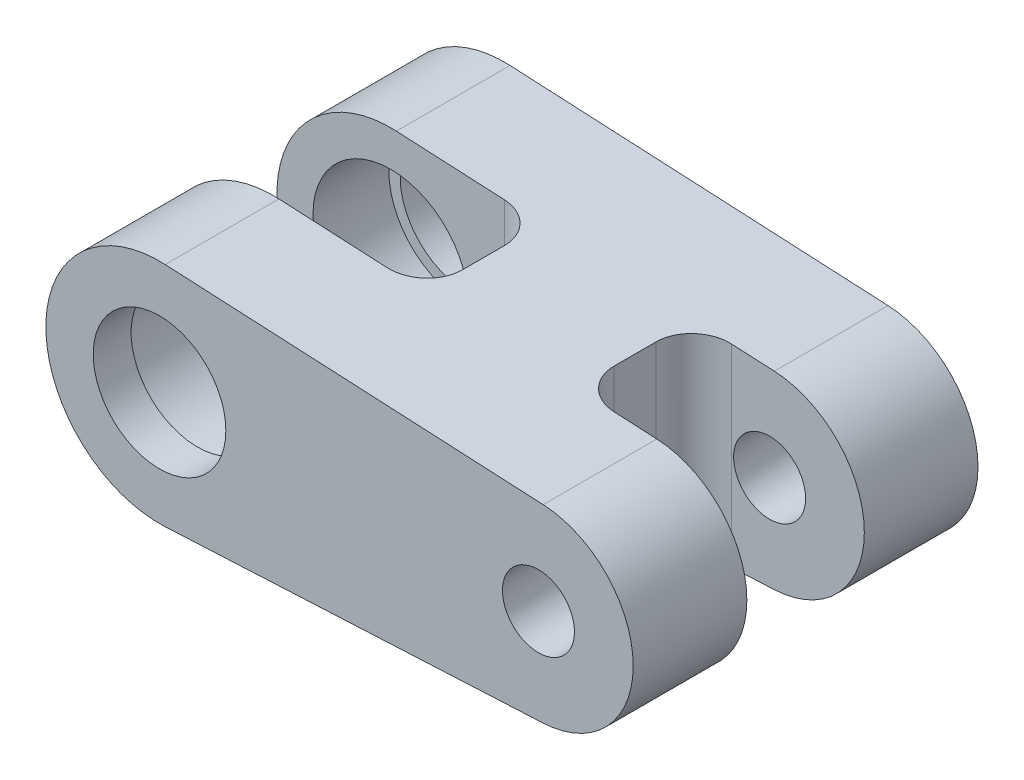
ISO-10303-21;
HEADER;
FILE_DESCRIPTION(('STEP AP214'),'2;1');
FILE_NAME('part.step','',(''),(''),'','','');
FILE_SCHEMA(('AUTOMOTIVE_DESIGN { 1 0 10303 214 1 1 1 1 }'));
ENDSEC;
DATA;
#1=APPLICATION_CONTEXT('core data for automotive mechanical design processes');
#2=APPLICATION_PROTOCOL_DEFINITION('international standard','automotive_design',2000,#1);
#3=PRODUCT_CONTEXT('',#1,'mechanical');
#4=PRODUCT('Part','Part','',(#3));
#5=PRODUCT_RELATED_PRODUCT_CATEGORY('part','',(#4));
#6=PRODUCT_DEFINITION_FORMATION('','',#4);
#7=PRODUCT_DEFINITION_CONTEXT('part definition',#1,'design');
#8=PRODUCT_DEFINITION('design','',#6,#7);
#9=PRODUCT_DEFINITION_SHAPE('','',#8);
#10=(LENGTH_UNIT() NAMED_UNIT(*) SI_UNIT(.MILLI.,.METRE.));
#11=(NAMED_UNIT(*) PLANE_ANGLE_UNIT() SI_UNIT($,.RADIAN.));
#12=(NAMED_UNIT(*) SI_UNIT($,.STERADIAN.) SOLID_ANGLE_UNIT());
#13=UNCERTAINTY_MEASURE_WITH_UNIT(LENGTH_MEASURE(1.E-05),#10,'distance_accuracy_value','');
#14=(GEOMETRIC_REPRESENTATION_CONTEXT(3) GLOBAL_UNCERTAINTY_ASSIGNED_CONTEXT((#13)) GLOBAL_UNIT_ASSIGNED_CONTEXT((#10,
#11,#12)) REPRESENTATION_CONTEXT('',''));
#15=CARTESIAN_POINT('',(0.,0.,0.));
#16=DIRECTION('',(0.,0.,1.));
#17=DIRECTION('',(1.,0.,0.));
#18=AXIS2_PLACEMENT_3D('',#15,#16,#17);
#19=CARTESIAN_POINT('',(0.,0.,-3.1));
#20=DIRECTION('',(0.,0.,-1.));
#21=DIRECTION('',(-1.,0.,0.));
#22=AXIS2_PLACEMENT_3D('',#19,#20,#21);
#23=PLANE('',#22);
#24=CARTESIAN_POINT('',(0.,0.,-3.1));
#25=DIRECTION('',(0.,0.,1.));
#26=DIRECTION('',(1.,0.,0.));
#27=AXIS2_PLACEMENT_3D('',#24,#25,#26);
#28=CIRCLE('',#27,1.9);
#29=CARTESIAN_POINT('',(1.9,0.,-3.1));
#30=VERTEX_POINT('',#29);
#31=EDGE_CURVE('E218',#30,#30,#28,.T.);
#32=ORIENTED_EDGE('',*,*,#31,.F.);
#33=EDGE_LOOP('',(#32));
#34=FACE_BOUND('',#33,.T.);
#35=DIRECTION('',(-0.998749217771909,0.0500000000000001,0.));
#36=VECTOR('',#35,1.);
#37=CARTESIAN_POINT('',(0.25,4.99374608885955,-3.1));
#38=LINE('',#37,#36);
#39=CARTESIAN_POINT('',(0.25,4.99374608885955,-3.1));
#40=VERTEX_POINT('',#39);
#41=CARTESIAN_POINT('',(-2.,5.10638697808194,-3.1));
#42=VERTEX_POINT('',#41);
#43=EDGE_CURVE('E240',#40,#42,#38,.T.);
#44=ORIENTED_EDGE('',*,*,#43,.T.);
#45=DIRECTION('',(0.,1.,0.));
#46=VECTOR('',#45,1.);
#47=CARTESIAN_POINT('',(-2.,-5.20651221294629,-3.1));
#48=LINE('',#47,#46);
#49=CARTESIAN_POINT('',(-2.,-5.10638697808194,-3.1));
#50=VERTEX_POINT('',#49);
#51=EDGE_CURVE('E60',#42,#50,#48,.F.);
#52=ORIENTED_EDGE('',*,*,#51,.T.);
#53=DIRECTION('',(0.998749217771909,0.0500000000000001,0.));
#54=VECTOR('',#53,1.);
#55=CARTESIAN_POINT('',(0.25,-4.99374608885955,-3.1));
#56=LINE('',#55,#54);
#57=CARTESIAN_POINT('',(0.25,-4.99374608885955,-3.1));
#58=VERTEX_POINT('',#57);
#59=EDGE_CURVE('E244',#50,#58,#56,.T.);
#60=ORIENTED_EDGE('',*,*,#59,.T.);
#61=CARTESIAN_POINT('',(0.,0.,-3.1));
#62=DIRECTION('',(0.,0.,1.));
#63=DIRECTION('',(-1.,0.,0.));
#64=AXIS2_PLACEMENT_3D('',#61,#62,#63);
#65=CIRCLE('',#64,5.);
#66=EDGE_CURVE('E235',#58,#40,#65,.T.);
#67=ORIENTED_EDGE('',*,*,#66,.T.);
#68=EDGE_LOOP('',(#44,#52,#60,#67));
#69=FACE_BOUND('',#68,.T.);
#70=ADVANCED_FACE('F39',(#34,#69),#23,.F.);
#71=CARTESIAN_POINT('',(-20.,0.,-3.1));
#72=DIRECTION('',(0.,0.,1.));
#73=DIRECTION('',(1.,0.,0.));
#74=AXIS2_PLACEMENT_3D('',#71,#72,#73);
#75=CIRCLE('',#74,4.1);
#76=CARTESIAN_POINT('',(-15.9,0.,-3.1));
#77=VERTEX_POINT('',#76);
#78=EDGE_CURVE('E232',#77,#77,#75,.T.);
#79=ORIENTED_EDGE('',*,*,#78,.F.);
#80=EDGE_LOOP('',(#79));
#81=FACE_BOUND('',#80,.T.);
#82=CARTESIAN_POINT('',(-19.7,-5.99249530663146,-3.1));
#83=VERTEX_POINT('',#82);
#84=CARTESIAN_POINT('',(-14.,-5.70713838726805,-3.1));
#85=VERTEX_POINT('',#84);
#86=EDGE_CURVE('E245',#83,#85,#56,.T.);
#87=ORIENTED_EDGE('',*,*,#86,.T.);
#88=DIRECTION('',(0.,-1.,0.));
#89=VECTOR('',#88,1.);
#90=CARTESIAN_POINT('',(-14.,5.6070131524037,-3.1));
#91=LINE('',#90,#89);
#92=CARTESIAN_POINT('',(-14.,5.70713838726805,-3.1));
#93=VERTEX_POINT('',#92);
#94=EDGE_CURVE('E279',#85,#93,#91,.F.);
#95=ORIENTED_EDGE('',*,*,#94,.T.);
#96=CARTESIAN_POINT('',(-19.7,5.99249530663146,-3.1));
#97=VERTEX_POINT('',#96);
#98=EDGE_CURVE('E238',#93,#97,#38,.T.);
#99=ORIENTED_EDGE('',*,*,#98,.T.);
#100=CARTESIAN_POINT('',(-20.,0.,-3.1));
#101=DIRECTION('',(0.,0.,1.));
#102=DIRECTION('',(1.,0.,0.));
#103=AXIS2_PLACEMENT_3D('',#100,#101,#102);
#104=CIRCLE('',#103,6.);
#105=EDGE_CURVE('E242',#97,#83,#104,.T.);
#106=ORIENTED_EDGE('',*,*,#105,.T.);
#107=EDGE_LOOP('',(#87,#95,#99,#106));
#108=FACE_BOUND('',#107,.T.);
#109=ADVANCED_FACE('F331',(#81,#108),#23,.F.);
#110=CARTESIAN_POINT('',(0.,0.,-3.1));
#111=DIRECTION('',(0.,0.,-1.));
#112=DIRECTION('',(-1.,0.,0.));
#113=AXIS2_PLACEMENT_3D('',#110,#111,#112);
#114=CYLINDRICAL_SURFACE('',#113,5.);
#115=CARTESIAN_POINT('',(0.,0.,-9.1));
#116=DIRECTION('',(0.,0.,1.));
#117=DIRECTION('',(-1.,0.,0.));
#118=AXIS2_PLACEMENT_3D('',#115,#116,#117);
#119=CIRCLE('',#118,5.);
#120=CARTESIAN_POINT('',(0.25,-4.99374608885955,-9.1));
#121=VERTEX_POINT('',#120);
#122=CARTESIAN_POINT('',(0.25,4.99374608885955,-9.1));
#123=VERTEX_POINT('',#122);
#124=EDGE_CURVE('E231',#121,#123,#119,.T.);
#125=ORIENTED_EDGE('',*,*,#124,.T.);
#126=DIRECTION('',(0.,0.,-1.));
#127=VECTOR('',#126,1.);
#128=CARTESIAN_POINT('',(0.25,4.99374608885955,-3.1));
#129=LINE('',#128,#127);
#130=EDGE_CURVE('E264',#40,#123,#129,.T.);
#131=ORIENTED_EDGE('',*,*,#130,.F.);
#132=ORIENTED_EDGE('',*,*,#66,.F.);
#133=DIRECTION('',(0.,0.,-1.));
#134=VECTOR('',#133,1.);
#135=CARTESIAN_POINT('',(0.25,-4.99374608885955,-3.1));
#136=LINE('',#135,#134);
#137=EDGE_CURVE('E248',#58,#121,#136,.T.);
#138=ORIENTED_EDGE('',*,*,#137,.T.);
#139=EDGE_LOOP('',(#125,#131,#132,#138));
#140=FACE_BOUND('',#139,.T.);
#141=ADVANCED_FACE('F316',(#140),#114,.T.);
#142=CARTESIAN_POINT('',(0.25,4.99374608885955,-3.1));
#143=DIRECTION('',(-0.05,-0.998749217771909,0.));
#144=DIRECTION('',(0.998749217771909,-0.0500000000000001,0.));
#145=AXIS2_PLACEMENT_3D('',#142,#143,#144);
#146=PLANE('',#145);
#147=DIRECTION('',(-0.998749217771909,0.0500000000000001,0.));
#148=VECTOR('',#147,1.);
#149=CARTESIAN_POINT('',(0.25,4.99374608885955,-9.1));
#150=LINE('',#149,#148);
#151=CARTESIAN_POINT('',(-19.7,5.99249530663146,-9.1));
#152=VERTEX_POINT('',#151);
#153=EDGE_CURVE('E251',#123,#152,#150,.T.);
#154=ORIENTED_EDGE('',*,*,#153,.T.);
#155=DIRECTION('',(0.,0.,-1.));
#156=VECTOR('',#155,1.);
#157=CARTESIAN_POINT('',(-19.7,5.99249530663146,-3.1));
#158=LINE('',#157,#156);
#159=EDGE_CURVE('E261',#97,#152,#158,.T.);
#160=ORIENTED_EDGE('',*,*,#159,.F.);
#161=ORIENTED_EDGE('',*,*,#98,.F.);
#162=CARTESIAN_POINT('',(-14.,5.70713838726805,-1.1));
#163=DIRECTION('',(-0.05,-0.998749217771909,0.));
#164=DIRECTION('',(-0.998749217771909,0.0500000000000001,0.));
#165=AXIS2_PLACEMENT_3D('',#162,#163,#164);
#166=ELLIPSE('',#165,2.00250469728704,2.);
#167=CARTESIAN_POINT('',(-12.,5.6070131524037,-1.1));
#168=VERTEX_POINT('',#167);
#169=EDGE_CURVE('E294',#93,#168,#166,.T.);
#170=ORIENTED_EDGE('',*,*,#169,.T.);
#171=DIRECTION('',(0.,0.,-1.));
#172=VECTOR('',#171,1.);
#173=CARTESIAN_POINT('',(-12.,5.6070131524037,13.7751365134765));
#174=LINE('',#173,#172);
#175=CARTESIAN_POINT('',(-12.,5.6070131524037,1.1));
#176=VERTEX_POINT('',#175);
#177=EDGE_CURVE('E212',#176,#168,#174,.T.);
#178=ORIENTED_EDGE('',*,*,#177,.F.);
#179=CARTESIAN_POINT('',(-14.,5.70713838726805,1.1));
#180=DIRECTION('',(-0.05,-0.998749217771909,0.));
#181=DIRECTION('',(-0.998749217771909,0.0500000000000001,0.));
#182=AXIS2_PLACEMENT_3D('',#179,#180,#181);
#183=ELLIPSE('',#182,2.00250469728704,2.);
#184=CARTESIAN_POINT('',(-14.,5.70713838726805,3.1));
#185=VERTEX_POINT('',#184);
#186=EDGE_CURVE('E290',#176,#185,#183,.T.);
#187=ORIENTED_EDGE('',*,*,#186,.T.);
#188=DIRECTION('',(-0.998749217771909,0.0500000000000001,0.));
#189=VECTOR('',#188,1.);
#190=CARTESIAN_POINT('',(0.25,4.99374608885955,3.1));
#191=LINE('',#190,#189);
#192=CARTESIAN_POINT('',(-19.7,5.99249530663146,3.1));
#193=VERTEX_POINT('',#192);
#194=EDGE_CURVE('E171',#185,#193,#191,.T.);
#195=ORIENTED_EDGE('',*,*,#194,.T.);
#196=DIRECTION('',(0.,0.,1.));
#197=VECTOR('',#196,1.);
#198=CARTESIAN_POINT('',(-19.7,5.99249530663146,3.1));
#199=LINE('',#198,#197);
#200=CARTESIAN_POINT('',(-19.7,5.99249530663146,9.1));
#201=VERTEX_POINT('',#200);
#202=EDGE_CURVE('E161',#193,#201,#199,.T.);
#203=ORIENTED_EDGE('',*,*,#202,.T.);
#204=DIRECTION('',(-0.998749217771909,0.0500000000000001,0.));
#205=VECTOR('',#204,1.);
#206=CARTESIAN_POINT('',(0.25,4.99374608885955,9.1));
#207=LINE('',#206,#205);
#208=CARTESIAN_POINT('',(0.25,4.99374608885955,9.1));
#209=VERTEX_POINT('',#208);
#210=EDGE_CURVE('E156',#209,#201,#207,.T.);
#211=ORIENTED_EDGE('',*,*,#210,.F.);
#212=DIRECTION('',(0.,0.,1.));
#213=VECTOR('',#212,1.);
#214=CARTESIAN_POINT('',(0.25,4.99374608885955,3.1));
#215=LINE('',#214,#213);
#216=CARTESIAN_POINT('',(0.25,4.99374608885955,3.1));
#217=VERTEX_POINT('',#216);
#218=EDGE_CURVE('E149',#217,#209,#215,.T.);
#219=ORIENTED_EDGE('',*,*,#218,.F.);
#220=CARTESIAN_POINT('',(-2.,5.10638697808194,3.1));
#221=VERTEX_POINT('',#220);
#222=EDGE_CURVE('E153',#217,#221,#191,.T.);
#223=ORIENTED_EDGE('',*,*,#222,.T.);
#224=CARTESIAN_POINT('',(-2.,5.10638697808194,1.1));
#225=DIRECTION('',(-0.05,-0.998749217771909,0.));
#226=DIRECTION('',(0.998749217771909,-0.0500000000000001,0.));
#227=AXIS2_PLACEMENT_3D('',#224,#225,#226);
#228=ELLIPSE('',#227,2.00250469728704,2.);
#229=CARTESIAN_POINT('',(-4.,5.20651221294629,1.1));
#230=VERTEX_POINT('',#229);
#231=EDGE_CURVE('E296',#221,#230,#228,.T.);
#232=ORIENTED_EDGE('',*,*,#231,.T.);
#233=DIRECTION('',(0.,0.,-1.));
#234=VECTOR('',#233,1.);
#235=CARTESIAN_POINT('',(-4.,5.20651221294629,13.7751365134765));
#236=LINE('',#235,#234);
#237=CARTESIAN_POINT('',(-4.,5.20651221294629,-1.1));
#238=VERTEX_POINT('',#237);
#239=EDGE_CURVE('E210',#230,#238,#236,.T.);
#240=ORIENTED_EDGE('',*,*,#239,.T.);
#241=CARTESIAN_POINT('',(-2.,5.10638697808194,-1.1));
#242=DIRECTION('',(-0.05,-0.998749217771909,0.));
#243=DIRECTION('',(0.998749217771909,-0.0500000000000001,0.));
#244=AXIS2_PLACEMENT_3D('',#241,#242,#243);
#245=ELLIPSE('',#244,2.00250469728704,2.);
#246=EDGE_CURVE('E47',#238,#42,#245,.T.);
#247=ORIENTED_EDGE('',*,*,#246,.T.);
#248=ORIENTED_EDGE('',*,*,#43,.F.);
#249=ORIENTED_EDGE('',*,*,#130,.T.);
#250=EDGE_LOOP('',(#154,#160,#161,#170,#178,#187,#195,#203,#211,#219,#223,#232,#240,#247,#248,#249));
#251=FACE_BOUND('',#250,.T.);
#252=ADVANCED_FACE('F151',(#251),#146,.F.);
#253=CARTESIAN_POINT('',(-20.,0.,-3.1));
#254=DIRECTION('',(0.,0.,-1.));
#255=DIRECTION('',(-1.,0.,0.));
#256=AXIS2_PLACEMENT_3D('',#253,#254,#255);
#257=CYLINDRICAL_SURFACE('',#256,6.);
#258=CARTESIAN_POINT('',(-20.,0.,-9.1));
#259=DIRECTION('',(0.,0.,1.));
#260=DIRECTION('',(1.,0.,0.));
#261=AXIS2_PLACEMENT_3D('',#258,#259,#260);
#262=CIRCLE('',#261,6.);
#263=CARTESIAN_POINT('',(-19.7,-5.99249530663146,-9.1));
#264=VERTEX_POINT('',#263);
#265=EDGE_CURVE('E253',#152,#264,#262,.T.);
#266=ORIENTED_EDGE('',*,*,#265,.T.);
#267=DIRECTION('',(0.,0.,-1.));
#268=VECTOR('',#267,1.);
#269=CARTESIAN_POINT('',(-19.7,-5.99249530663146,-3.1));
#270=LINE('',#269,#268);
#271=EDGE_CURVE('E258',#83,#264,#270,.T.);
#272=ORIENTED_EDGE('',*,*,#271,.F.);
#273=ORIENTED_EDGE('',*,*,#105,.F.);
#274=ORIENTED_EDGE('',*,*,#159,.T.);
#275=EDGE_LOOP('',(#266,#272,#273,#274));
#276=FACE_BOUND('',#275,.T.);
#277=ADVANCED_FACE('F324',(#276),#257,.T.);
#278=CARTESIAN_POINT('',(0.25,-4.99374608885955,-3.1));
#279=DIRECTION('',(-0.05,0.998749217771909,0.));
#280=DIRECTION('',(-0.998749217771909,-0.0500000000000001,0.));
#281=AXIS2_PLACEMENT_3D('',#278,#279,#280);
#282=PLANE('',#281);
#283=DIRECTION('',(0.998749217771909,0.0500000000000001,0.));
#284=VECTOR('',#283,1.);
#285=CARTESIAN_POINT('',(0.25,-4.99374608885955,-9.1));
#286=LINE('',#285,#284);
#287=EDGE_CURVE('E239',#264,#121,#286,.T.);
#288=ORIENTED_EDGE('',*,*,#287,.T.);
#289=ORIENTED_EDGE('',*,*,#137,.F.);
#290=ORIENTED_EDGE('',*,*,#59,.F.);
#291=CARTESIAN_POINT('',(-2.,-5.10638697808194,-1.1));
#292=DIRECTION('',(-0.05,0.998749217771909,0.));
#293=DIRECTION('',(-0.998749217771909,-0.0500000000000001,0.));
#294=AXIS2_PLACEMENT_3D('',#291,#292,#293);
#295=ELLIPSE('',#294,2.00250469728704,2.);
#296=CARTESIAN_POINT('',(-4.,-5.20651221294629,-1.1));
#297=VERTEX_POINT('',#296);
#298=EDGE_CURVE('E11',#50,#297,#295,.T.);
#299=ORIENTED_EDGE('',*,*,#298,.T.);
#300=DIRECTION('',(0.,0.,-1.));
#301=VECTOR('',#300,1.);
#302=CARTESIAN_POINT('',(-4.,-5.20651221294629,13.7751365134765));
#303=LINE('',#302,#301);
#304=CARTESIAN_POINT('',(-4.,-5.20651221294629,1.1));
#305=VERTEX_POINT('',#304);
#306=EDGE_CURVE('E160',#305,#297,#303,.T.);
#307=ORIENTED_EDGE('',*,*,#306,.F.);
#308=CARTESIAN_POINT('',(-2.,-5.10638697808194,1.1));
#309=DIRECTION('',(-0.05,0.998749217771909,0.));
#310=DIRECTION('',(-0.998749217771909,-0.0500000000000001,0.));
#311=AXIS2_PLACEMENT_3D('',#308,#309,#310);
#312=ELLIPSE('',#311,2.00250469728704,2.);
#313=CARTESIAN_POINT('',(-2.,-5.10638697808194,3.1));
#314=VERTEX_POINT('',#313);
#315=EDGE_CURVE('E298',#305,#314,#312,.T.);
#316=ORIENTED_EDGE('',*,*,#315,.T.);
#317=DIRECTION('',(0.998749217771909,0.0500000000000001,0.));
#318=VECTOR('',#317,1.);
#319=CARTESIAN_POINT('',(0.25,-4.99374608885955,3.1));
#320=LINE('',#319,#318);
#321=CARTESIAN_POINT('',(0.25,-4.99374608885955,3.1));
#322=VERTEX_POINT('',#321);
#323=EDGE_CURVE('E181',#314,#322,#320,.T.);
#324=ORIENTED_EDGE('',*,*,#323,.T.);
#325=DIRECTION('',(0.,0.,1.));
#326=VECTOR('',#325,1.);
#327=CARTESIAN_POINT('',(0.25,-4.99374608885955,3.1));
#328=LINE('',#327,#326);
#329=CARTESIAN_POINT('',(0.25,-4.99374608885955,9.1));
#330=VERTEX_POINT('',#329);
#331=EDGE_CURVE('E168',#322,#330,#328,.T.);
#332=ORIENTED_EDGE('',*,*,#331,.T.);
#333=DIRECTION('',(0.998749217771909,0.0500000000000001,0.));
#334=VECTOR('',#333,1.);
#335=CARTESIAN_POINT('',(0.25,-4.99374608885955,9.1));
#336=LINE('',#335,#334);
#337=CARTESIAN_POINT('',(-19.7,-5.99249530663146,9.1));
#338=VERTEX_POINT('',#337);
#339=EDGE_CURVE('E172',#338,#330,#336,.T.);
#340=ORIENTED_EDGE('',*,*,#339,.F.);
#341=DIRECTION('',(0.,0.,1.));
#342=VECTOR('',#341,1.);
#343=CARTESIAN_POINT('',(-19.7,-5.99249530663146,3.1));
#344=LINE('',#343,#342);
#345=CARTESIAN_POINT('',(-19.7,-5.99249530663146,3.1));
#346=VERTEX_POINT('',#345);
#347=EDGE_CURVE('E197',#346,#338,#344,.T.);
#348=ORIENTED_EDGE('',*,*,#347,.F.);
#349=CARTESIAN_POINT('',(-14.,-5.70713838726805,3.1));
#350=VERTEX_POINT('',#349);
#351=EDGE_CURVE('E185',#346,#350,#320,.T.);
#352=ORIENTED_EDGE('',*,*,#351,.T.);
#353=CARTESIAN_POINT('',(-14.,-5.70713838726805,1.1));
#354=DIRECTION('',(-0.05,0.998749217771909,0.));
#355=DIRECTION('',(0.998749217771909,0.0500000000000001,0.));
#356=AXIS2_PLACEMENT_3D('',#353,#354,#355);
#357=ELLIPSE('',#356,2.00250469728704,2.);
#358=CARTESIAN_POINT('',(-12.,-5.6070131524037,1.1));
#359=VERTEX_POINT('',#358);
#360=EDGE_CURVE('E288',#350,#359,#357,.T.);
#361=ORIENTED_EDGE('',*,*,#360,.T.);
#362=DIRECTION('',(0.,0.,-1.));
#363=VECTOR('',#362,1.);
#364=CARTESIAN_POINT('',(-12.,-5.6070131524037,13.7751365134765));
#365=LINE('',#364,#363);
#366=CARTESIAN_POINT('',(-12.,-5.6070131524037,-1.1));
#367=VERTEX_POINT('',#366);
#368=EDGE_CURVE('E215',#359,#367,#365,.T.);
#369=ORIENTED_EDGE('',*,*,#368,.T.);
#370=CARTESIAN_POINT('',(-14.,-5.70713838726805,-1.1));
#371=DIRECTION('',(-0.05,0.998749217771909,0.));
#372=DIRECTION('',(0.998749217771909,0.0500000000000001,0.));
#373=AXIS2_PLACEMENT_3D('',#370,#371,#372);
#374=ELLIPSE('',#373,2.00250469728704,2.);
#375=EDGE_CURVE('E292',#367,#85,#374,.T.);
#376=ORIENTED_EDGE('',*,*,#375,.T.);
#377=ORIENTED_EDGE('',*,*,#86,.F.);
#378=ORIENTED_EDGE('',*,*,#271,.T.);
#379=EDGE_LOOP('',(#288,#289,#290,#299,#307,#316,#324,#332,#340,#348,#352,#361,#369,#376,#377,#378));
#380=FACE_BOUND('',#379,.T.);
#381=ADVANCED_FACE('F302',(#380),#282,.F.);
#382=CARTESIAN_POINT('',(0.,0.,-9.1));
#383=DIRECTION('',(0.,0.,-1.));
#384=DIRECTION('',(-1.,0.,0.));
#385=AXIS2_PLACEMENT_3D('',#382,#383,#384);
#386=PLANE('',#385);
#387=CARTESIAN_POINT('',(0.,0.,-9.1));
#388=DIRECTION('',(0.,0.,-1.));
#389=DIRECTION('',(-1.,0.,0.));
#390=AXIS2_PLACEMENT_3D('',#387,#388,#389);
#391=CIRCLE('',#390,1.9);
#392=CARTESIAN_POINT('',(-1.9,0.,-9.1));
#393=VERTEX_POINT('',#392);
#394=EDGE_CURVE('E223',#393,#393,#391,.T.);
#395=ORIENTED_EDGE('',*,*,#394,.F.);
#396=EDGE_LOOP('',(#395));
#397=FACE_BOUND('',#396,.T.);
#398=CARTESIAN_POINT('',(-20.,0.,-9.1));
#399=DIRECTION('',(0.,0.,1.));
#400=DIRECTION('',(1.,0.,0.));
#401=AXIS2_PLACEMENT_3D('',#398,#399,#400);
#402=CIRCLE('',#401,3.5);
#403=CARTESIAN_POINT('',(-16.5,0.,-9.1));
#404=VERTEX_POINT('',#403);
#405=EDGE_CURVE('E224',#404,#404,#402,.T.);
#406=ORIENTED_EDGE('',*,*,#405,.T.);
#407=EDGE_LOOP('',(#406));
#408=FACE_BOUND('',#407,.T.);
#409=ORIENTED_EDGE('',*,*,#124,.F.);
#410=ORIENTED_EDGE('',*,*,#287,.F.);
#411=ORIENTED_EDGE('',*,*,#265,.F.);
#412=ORIENTED_EDGE('',*,*,#153,.F.);
#413=EDGE_LOOP('',(#409,#410,#411,#412));
#414=FACE_BOUND('',#413,.T.);
#415=ADVANCED_FACE('F327',(#397,#408,#414),#386,.T.);
#416=CARTESIAN_POINT('',(-20.,0.,-7.1));
#417=DIRECTION('',(0.,0.,1.));
#418=DIRECTION('',(1.,0.,0.));
#419=AXIS2_PLACEMENT_3D('',#416,#417,#418);
#420=CYLINDRICAL_SURFACE('',#419,4.1);
#421=CARTESIAN_POINT('',(-20.,0.,-7.1));
#422=DIRECTION('',(0.,0.,1.));
#423=DIRECTION('',(1.,0.,0.));
#424=AXIS2_PLACEMENT_3D('',#421,#422,#423);
#425=CIRCLE('',#424,4.1);
#426=CARTESIAN_POINT('',(-15.9,0.,-7.1));
#427=VERTEX_POINT('',#426);
#428=EDGE_CURVE('E228',#427,#427,#425,.T.);
#429=ORIENTED_EDGE('',*,*,#428,.F.);
#430=EDGE_LOOP('',(#429));
#431=FACE_BOUND('',#430,.T.);
#432=ORIENTED_EDGE('',*,*,#78,.T.);
#433=EDGE_LOOP('',(#432));
#434=FACE_BOUND('',#433,.T.);
#435=ADVANCED_FACE('F379',(#431,#434),#420,.F.);
#436=CARTESIAN_POINT('',(-20.,0.,-7.1));
#437=DIRECTION('',(0.,0.,1.));
#438=DIRECTION('',(1.,0.,0.));
#439=AXIS2_PLACEMENT_3D('',#436,#437,#438);
#440=PLANE('',#439);
#441=CARTESIAN_POINT('',(-20.,0.,-7.1));
#442=DIRECTION('',(0.,0.,1.));
#443=DIRECTION('',(1.,0.,0.));
#444=AXIS2_PLACEMENT_3D('',#441,#442,#443);
#445=CIRCLE('',#444,3.5);
#446=CARTESIAN_POINT('',(-16.5,0.,-7.1));
#447=VERTEX_POINT('',#446);
#448=EDGE_CURVE('E227',#447,#447,#445,.T.);
#449=ORIENTED_EDGE('',*,*,#448,.F.);
#450=EDGE_LOOP('',(#449));
#451=FACE_BOUND('',#450,.T.);
#452=ORIENTED_EDGE('',*,*,#428,.T.);
#453=EDGE_LOOP('',(#452));
#454=FACE_BOUND('',#453,.T.);
#455=ADVANCED_FACE('F571',(#451,#454),#440,.T.);
#456=CARTESIAN_POINT('',(-20.,0.,-9.1));
#457=DIRECTION('',(0.,0.,1.));
#458=DIRECTION('',(1.,0.,0.));
#459=AXIS2_PLACEMENT_3D('',#456,#457,#458);
#460=CYLINDRICAL_SURFACE('',#459,3.5);
#461=ORIENTED_EDGE('',*,*,#448,.T.);
#462=EDGE_LOOP('',(#461));
#463=FACE_BOUND('',#462,.T.);
#464=ORIENTED_EDGE('',*,*,#405,.F.);
#465=EDGE_LOOP('',(#464));
#466=FACE_BOUND('',#465,.T.);
#467=ADVANCED_FACE('F552',(#463,#466),#460,.F.);
#468=CARTESIAN_POINT('',(0.,0.,-13.1));
#469=DIRECTION('',(0.,0.,1.));
#470=DIRECTION('',(1.,0.,0.));
#471=AXIS2_PLACEMENT_3D('',#468,#469,#470);
#472=CYLINDRICAL_SURFACE('',#471,1.9);
#473=ORIENTED_EDGE('',*,*,#394,.T.);
#474=EDGE_LOOP('',(#473));
#475=FACE_BOUND('',#474,.T.);
#476=ORIENTED_EDGE('',*,*,#31,.T.);
#477=EDGE_LOOP('',(#476));
#478=FACE_BOUND('',#477,.T.);
#479=ADVANCED_FACE('F462',(#475,#478),#472,.F.);
#480=CARTESIAN_POINT('',(-4.,5.20651221294629,13.7751365134765));
#481=DIRECTION('',(-1.,0.,0.));
#482=DIRECTION('',(0.,-1.,0.));
#483=AXIS2_PLACEMENT_3D('',#480,#481,#482);
#484=PLANE('',#483);
#485=ORIENTED_EDGE('',*,*,#239,.F.);
#486=DIRECTION('',(0.,1.,0.));
#487=VECTOR('',#486,1.);
#488=CARTESIAN_POINT('',(-4.,-5.20651221294629,1.1));
#489=LINE('',#488,#487);
#490=EDGE_CURVE('E285',#230,#305,#489,.F.);
#491=ORIENTED_EDGE('',*,*,#490,.T.);
#492=ORIENTED_EDGE('',*,*,#306,.T.);
#493=DIRECTION('',(0.,1.,0.));
#494=VECTOR('',#493,1.);
#495=CARTESIAN_POINT('',(-4.,5.20651221294629,-1.1));
#496=LINE('',#495,#494);
#497=EDGE_CURVE('E282',#297,#238,#496,.T.);
#498=ORIENTED_EDGE('',*,*,#497,.T.);
#499=EDGE_LOOP('',(#485,#491,#492,#498));
#500=FACE_BOUND('',#499,.T.);
#501=ADVANCED_FACE('F308',(#500),#484,.F.);
#502=CARTESIAN_POINT('',(-12.,5.6070131524037,13.7751365134765));
#503=DIRECTION('',(1.,0.,0.));
#504=DIRECTION('',(0.,1.,0.));
#505=AXIS2_PLACEMENT_3D('',#502,#503,#504);
#506=PLANE('',#505);
#507=ORIENTED_EDGE('',*,*,#368,.F.);
#508=DIRECTION('',(0.,-1.,0.));
#509=VECTOR('',#508,1.);
#510=CARTESIAN_POINT('',(-12.,5.6070131524037,1.1));
#511=LINE('',#510,#509);
#512=EDGE_CURVE('E277',#359,#176,#511,.F.);
#513=ORIENTED_EDGE('',*,*,#512,.T.);
#514=ORIENTED_EDGE('',*,*,#177,.T.);
#515=DIRECTION('',(0.,-1.,0.));
#516=VECTOR('',#515,1.);
#517=CARTESIAN_POINT('',(-12.,-5.6070131524037,-1.1));
#518=LINE('',#517,#516);
#519=EDGE_CURVE('E274',#168,#367,#518,.T.);
#520=ORIENTED_EDGE('',*,*,#519,.T.);
#521=EDGE_LOOP('',(#507,#513,#514,#520));
#522=FACE_BOUND('',#521,.T.);
#523=ADVANCED_FACE('F340',(#522),#506,.F.);
#524=CARTESIAN_POINT('',(0.,0.,3.1));
#525=DIRECTION('',(0.,0.,1.));
#526=DIRECTION('',(-1.,0.,0.));
#527=AXIS2_PLACEMENT_3D('',#524,#525,#526);
#528=PLANE('',#527);
#529=CARTESIAN_POINT('',(0.,0.,3.1));
#530=DIRECTION('',(0.,0.,1.));
#531=DIRECTION('',(1.,0.,0.));
#532=AXIS2_PLACEMENT_3D('',#529,#530,#531);
#533=CIRCLE('',#532,1.9);
#534=CARTESIAN_POINT('',(1.9,0.,3.1));
#535=VERTEX_POINT('',#534);
#536=EDGE_CURVE('E209',#535,#535,#533,.T.);
#537=ORIENTED_EDGE('',*,*,#536,.T.);
#538=EDGE_LOOP('',(#537));
#539=FACE_BOUND('',#538,.T.);
#540=ORIENTED_EDGE('',*,*,#323,.F.);
#541=DIRECTION('',(0.,1.,0.));
#542=VECTOR('',#541,1.);
#543=CARTESIAN_POINT('',(-2.,5.20651221294629,3.1));
#544=LINE('',#543,#542);
#545=EDGE_CURVE('E177',#314,#221,#544,.T.);
#546=ORIENTED_EDGE('',*,*,#545,.T.);
#547=ORIENTED_EDGE('',*,*,#222,.F.);
#548=CARTESIAN_POINT('',(0.,0.,3.1));
#549=DIRECTION('',(0.,0.,1.));
#550=DIRECTION('',(-1.,0.,0.));
#551=AXIS2_PLACEMENT_3D('',#548,#549,#550);
#552=CIRCLE('',#551,5.);
#553=EDGE_CURVE('E165',#322,#217,#552,.T.);
#554=ORIENTED_EDGE('',*,*,#553,.F.);
#555=EDGE_LOOP('',(#540,#546,#547,#554));
#556=FACE_BOUND('',#555,.T.);
#557=ADVANCED_FACE('F175',(#539,#556),#528,.F.);
#558=CARTESIAN_POINT('',(-20.,0.,3.1));
#559=DIRECTION('',(0.,0.,1.));
#560=DIRECTION('',(1.,0.,0.));
#561=AXIS2_PLACEMENT_3D('',#558,#559,#560);
#562=CIRCLE('',#561,4.1);
#563=CARTESIAN_POINT('',(-15.9,0.,3.1));
#564=VERTEX_POINT('',#563);
#565=EDGE_CURVE('E204',#564,#564,#562,.T.);
#566=ORIENTED_EDGE('',*,*,#565,.T.);
#567=EDGE_LOOP('',(#566));
#568=FACE_BOUND('',#567,.T.);
#569=ORIENTED_EDGE('',*,*,#194,.F.);
#570=DIRECTION('',(0.,-1.,0.));
#571=VECTOR('',#570,1.);
#572=CARTESIAN_POINT('',(-14.,-5.6070131524037,3.1));
#573=LINE('',#572,#571);
#574=EDGE_CURVE('E267',#185,#350,#573,.T.);
#575=ORIENTED_EDGE('',*,*,#574,.T.);
#576=ORIENTED_EDGE('',*,*,#351,.F.);
#577=CARTESIAN_POINT('',(-20.,0.,3.1));
#578=DIRECTION('',(0.,0.,1.));
#579=DIRECTION('',(1.,0.,0.));
#580=AXIS2_PLACEMENT_3D('',#577,#578,#579);
#581=CIRCLE('',#580,6.);
#582=EDGE_CURVE('E178',#193,#346,#581,.T.);
#583=ORIENTED_EDGE('',*,*,#582,.F.);
#584=EDGE_LOOP('',(#569,#575,#576,#583));
#585=FACE_BOUND('',#584,.T.);
#586=ADVANCED_FACE('F349',(#568,#585),#528,.F.);
#587=CARTESIAN_POINT('',(0.,0.,3.1));
#588=DIRECTION('',(0.,0.,1.));
#589=DIRECTION('',(-1.,0.,0.));
#590=AXIS2_PLACEMENT_3D('',#587,#588,#589);
#591=CYLINDRICAL_SURFACE('',#590,5.);
#592=CARTESIAN_POINT('',(0.,0.,9.1));
#593=DIRECTION('',(0.,0.,1.));
#594=DIRECTION('',(-1.,0.,0.));
#595=AXIS2_PLACEMENT_3D('',#592,#593,#594);
#596=CIRCLE('',#595,5.);
#597=EDGE_CURVE('E188',#330,#209,#596,.T.);
#598=ORIENTED_EDGE('',*,*,#597,.F.);
#599=ORIENTED_EDGE('',*,*,#331,.F.);
#600=ORIENTED_EDGE('',*,*,#553,.T.);
#601=ORIENTED_EDGE('',*,*,#218,.T.);
#602=EDGE_LOOP('',(#598,#599,#600,#601));
#603=FACE_BOUND('',#602,.T.);
#604=ADVANCED_FACE('F166',(#603),#591,.T.);
#605=CARTESIAN_POINT('',(-20.,0.,3.1));
#606=DIRECTION('',(0.,0.,1.));
#607=DIRECTION('',(-1.,0.,0.));
#608=AXIS2_PLACEMENT_3D('',#605,#606,#607);
#609=CYLINDRICAL_SURFACE('',#608,6.);
#610=CARTESIAN_POINT('',(-20.,0.,9.1));
#611=DIRECTION('',(0.,0.,1.));
#612=DIRECTION('',(1.,0.,0.));
#613=AXIS2_PLACEMENT_3D('',#610,#611,#612);
#614=CIRCLE('',#613,6.);
#615=EDGE_CURVE('E192',#201,#338,#614,.T.);
#616=ORIENTED_EDGE('',*,*,#615,.F.);
#617=ORIENTED_EDGE('',*,*,#202,.F.);
#618=ORIENTED_EDGE('',*,*,#582,.T.);
#619=ORIENTED_EDGE('',*,*,#347,.T.);
#620=EDGE_LOOP('',(#616,#617,#618,#619));
#621=FACE_BOUND('',#620,.T.);
#622=ADVANCED_FACE('F352',(#621),#609,.T.);
#623=CARTESIAN_POINT('',(0.,0.,9.1));
#624=DIRECTION('',(0.,0.,1.));
#625=DIRECTION('',(-1.,0.,0.));
#626=AXIS2_PLACEMENT_3D('',#623,#624,#625);
#627=PLANE('',#626);
#628=CARTESIAN_POINT('',(0.,0.,9.1));
#629=DIRECTION('',(0.,0.,-1.));
#630=DIRECTION('',(-1.,0.,0.));
#631=AXIS2_PLACEMENT_3D('',#628,#629,#630);
#632=CIRCLE('',#631,1.9);
#633=CARTESIAN_POINT('',(-1.9,0.,9.1));
#634=VERTEX_POINT('',#633);
#635=EDGE_CURVE('E206',#634,#634,#632,.T.);
#636=ORIENTED_EDGE('',*,*,#635,.T.);
#637=EDGE_LOOP('',(#636));
#638=FACE_BOUND('',#637,.T.);
#639=CARTESIAN_POINT('',(-20.,0.,9.1));
#640=DIRECTION('',(0.,0.,1.));
#641=DIRECTION('',(1.,0.,0.));
#642=AXIS2_PLACEMENT_3D('',#639,#640,#641);
#643=CIRCLE('',#642,3.5);
#644=CARTESIAN_POINT('',(-16.5,0.,9.1));
#645=VERTEX_POINT('',#644);
#646=EDGE_CURVE('E205',#645,#645,#643,.T.);
#647=ORIENTED_EDGE('',*,*,#646,.F.);
#648=EDGE_LOOP('',(#647));
#649=FACE_BOUND('',#648,.T.);
#650=ORIENTED_EDGE('',*,*,#597,.T.);
#651=ORIENTED_EDGE('',*,*,#210,.T.);
#652=ORIENTED_EDGE('',*,*,#615,.T.);
#653=ORIENTED_EDGE('',*,*,#339,.T.);
#654=EDGE_LOOP('',(#650,#651,#652,#653));
#655=FACE_BOUND('',#654,.T.);
#656=ADVANCED_FACE('F354',(#638,#649,#655),#627,.T.);
#657=CARTESIAN_POINT('',(-20.,0.,7.1));
#658=DIRECTION('',(0.,0.,-1.));
#659=DIRECTION('',(1.,0.,0.));
#660=AXIS2_PLACEMENT_3D('',#657,#658,#659);
#661=CYLINDRICAL_SURFACE('',#660,4.1);
#662=CARTESIAN_POINT('',(-20.,0.,7.1));
#663=DIRECTION('',(0.,0.,1.));
#664=DIRECTION('',(1.,0.,0.));
#665=AXIS2_PLACEMENT_3D('',#662,#663,#664);
#666=CIRCLE('',#665,4.1);
#667=CARTESIAN_POINT('',(-15.9,0.,7.1));
#668=VERTEX_POINT('',#667);
#669=EDGE_CURVE('E190',#668,#668,#666,.T.);
#670=ORIENTED_EDGE('',*,*,#669,.T.);
#671=EDGE_LOOP('',(#670));
#672=FACE_BOUND('',#671,.T.);
#673=ORIENTED_EDGE('',*,*,#565,.F.);
#674=EDGE_LOOP('',(#673));
#675=FACE_BOUND('',#674,.T.);
#676=ADVANCED_FACE('F356',(#672,#675),#661,.F.);
#677=CARTESIAN_POINT('',(-20.,0.,7.1));
#678=DIRECTION('',(0.,0.,-1.));
#679=DIRECTION('',(1.,0.,0.));
#680=AXIS2_PLACEMENT_3D('',#677,#678,#679);
#681=PLANE('',#680);
#682=CARTESIAN_POINT('',(-20.,0.,7.1));
#683=DIRECTION('',(0.,0.,1.));
#684=DIRECTION('',(1.,0.,0.));
#685=AXIS2_PLACEMENT_3D('',#682,#683,#684);
#686=CIRCLE('',#685,3.5);
#687=CARTESIAN_POINT('',(-16.5,0.,7.1));
#688=VERTEX_POINT('',#687);
#689=EDGE_CURVE('E201',#688,#688,#686,.T.);
#690=ORIENTED_EDGE('',*,*,#689,.T.);
#691=EDGE_LOOP('',(#690));
#692=FACE_BOUND('',#691,.T.);
#693=ORIENTED_EDGE('',*,*,#669,.F.);
#694=EDGE_LOOP('',(#693));
#695=FACE_BOUND('',#694,.T.);
#696=ADVANCED_FACE('F363',(#692,#695),#681,.T.);
#697=CARTESIAN_POINT('',(-20.,0.,9.1));
#698=DIRECTION('',(0.,0.,-1.));
#699=DIRECTION('',(1.,0.,0.));
#700=AXIS2_PLACEMENT_3D('',#697,#698,#699);
#701=CYLINDRICAL_SURFACE('',#700,3.5);
#702=ORIENTED_EDGE('',*,*,#689,.F.);
#703=EDGE_LOOP('',(#702));
#704=FACE_BOUND('',#703,.T.);
#705=ORIENTED_EDGE('',*,*,#646,.T.);
#706=EDGE_LOOP('',(#705));
#707=FACE_BOUND('',#706,.T.);
#708=ADVANCED_FACE('F496',(#704,#707),#701,.F.);
#709=CARTESIAN_POINT('',(0.,0.,13.1));
#710=DIRECTION('',(0.,0.,-1.));
#711=DIRECTION('',(1.,0.,0.));
#712=AXIS2_PLACEMENT_3D('',#709,#710,#711);
#713=CYLINDRICAL_SURFACE('',#712,1.9);
#714=ORIENTED_EDGE('',*,*,#635,.F.);
#715=EDGE_LOOP('',(#714));
#716=FACE_BOUND('',#715,.T.);
#717=ORIENTED_EDGE('',*,*,#536,.F.);
#718=EDGE_LOOP('',(#717));
#719=FACE_BOUND('',#718,.T.);
#720=ADVANCED_FACE('F394',(#716,#719),#713,.F.);
#721=CARTESIAN_POINT('',(-14.,0.,1.1));
#722=DIRECTION('',(0.,1.,0.));
#723=DIRECTION('',(-1.,0.,0.));
#724=AXIS2_PLACEMENT_3D('',#721,#722,#723);
#725=CYLINDRICAL_SURFACE('',#724,2.);
#726=ORIENTED_EDGE('',*,*,#186,.F.);
#727=ORIENTED_EDGE('',*,*,#512,.F.);
#728=ORIENTED_EDGE('',*,*,#360,.F.);
#729=ORIENTED_EDGE('',*,*,#574,.F.);
#730=EDGE_LOOP('',(#726,#727,#728,#729));
#731=FACE_BOUND('',#730,.T.);
#732=ADVANCED_FACE('F343',(#731),#725,.F.);
#733=CARTESIAN_POINT('',(-14.,5.6070131524037,-1.1));
#734=DIRECTION('',(0.,1.,0.));
#735=DIRECTION('',(-1.,0.,0.));
#736=AXIS2_PLACEMENT_3D('',#733,#734,#735);
#737=CYLINDRICAL_SURFACE('',#736,2.);
#738=ORIENTED_EDGE('',*,*,#169,.F.);
#739=ORIENTED_EDGE('',*,*,#94,.F.);
#740=ORIENTED_EDGE('',*,*,#375,.F.);
#741=ORIENTED_EDGE('',*,*,#519,.F.);
#742=EDGE_LOOP('',(#738,#739,#740,#741));
#743=FACE_BOUND('',#742,.T.);
#744=ADVANCED_FACE('F334',(#743),#737,.F.);
#745=CARTESIAN_POINT('',(-2.,0.,1.1));
#746=DIRECTION('',(0.,-1.,0.));
#747=DIRECTION('',(1.,0.,0.));
#748=AXIS2_PLACEMENT_3D('',#745,#746,#747);
#749=CYLINDRICAL_SURFACE('',#748,2.);
#750=ORIENTED_EDGE('',*,*,#315,.F.);
#751=ORIENTED_EDGE('',*,*,#490,.F.);
#752=ORIENTED_EDGE('',*,*,#231,.F.);
#753=ORIENTED_EDGE('',*,*,#545,.F.);
#754=EDGE_LOOP('',(#750,#751,#752,#753));
#755=FACE_BOUND('',#754,.T.);
#756=ADVANCED_FACE('F305',(#755),#749,.F.);
#757=CARTESIAN_POINT('',(-2.,5.20651221294629,-1.1));
#758=DIRECTION('',(0.,-1.,0.));
#759=DIRECTION('',(1.,0.,0.));
#760=AXIS2_PLACEMENT_3D('',#757,#758,#759);
#761=CYLINDRICAL_SURFACE('',#760,2.);
#762=ORIENTED_EDGE('',*,*,#298,.F.);
#763=ORIENTED_EDGE('',*,*,#51,.F.);
#764=ORIENTED_EDGE('',*,*,#246,.F.);
#765=ORIENTED_EDGE('',*,*,#497,.F.);
#766=EDGE_LOOP('',(#762,#763,#764,#765));
#767=FACE_BOUND('',#766,.T.);
#768=ADVANCED_FACE('F41',(#767),#761,.F.);
#769=CLOSED_SHELL('',(#70,#109,#141,#252,#277,#381,#415,#435,#455,#467,#479,#501,#523,#557,#586,
#604,#622,#656,#676,#696,#708,#720,#732,#744,#756,#768));
#770=MANIFOLD_SOLID_BREP('B2',#769);
#771=ADVANCED_BREP_SHAPE_REPRESENTATION('',(#18,#770),#14);
#772=SHAPE_DEFINITION_REPRESENTATION(#9,#771);
ENDSEC;
END-ISO-10303-21;
